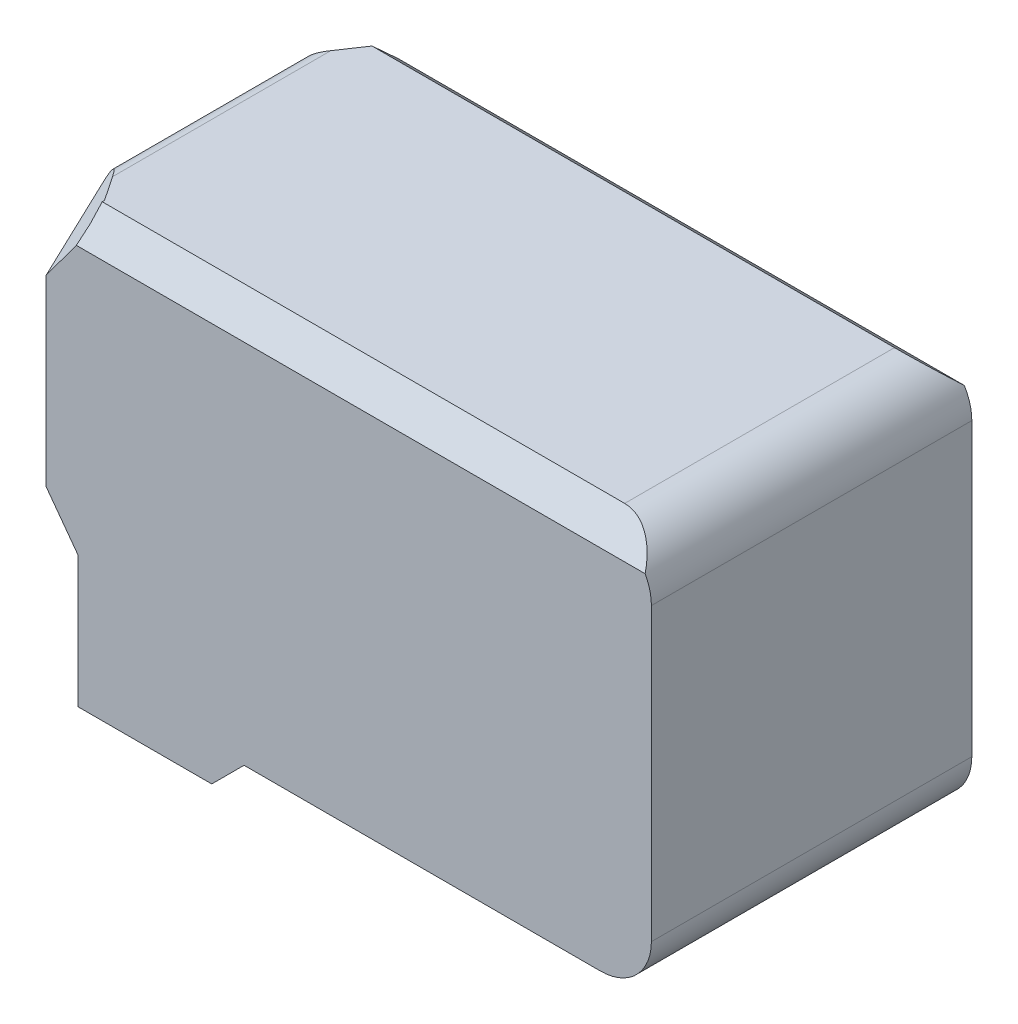
ISO-10303-21;
HEADER;
FILE_DESCRIPTION(('STEP AP214'),'2;1');
FILE_NAME('part.step','',(''),(''),'','','');
FILE_SCHEMA(('AUTOMOTIVE_DESIGN { 1 0 10303 214 1 1 1 1 }'));
ENDSEC;
DATA;
#1=APPLICATION_CONTEXT('core data for automotive mechanical design processes');
#2=APPLICATION_PROTOCOL_DEFINITION('international standard','automotive_design',2000,#1);
#3=PRODUCT_CONTEXT('',#1,'mechanical');
#4=PRODUCT('Part','Part','',(#3));
#5=PRODUCT_RELATED_PRODUCT_CATEGORY('part','',(#4));
#6=PRODUCT_DEFINITION_FORMATION('','',#4);
#7=PRODUCT_DEFINITION_CONTEXT('part definition',#1,'design');
#8=PRODUCT_DEFINITION('design','',#6,#7);
#9=PRODUCT_DEFINITION_SHAPE('','',#8);
#10=(LENGTH_UNIT() NAMED_UNIT(*) SI_UNIT(.MILLI.,.METRE.));
#11=(NAMED_UNIT(*) PLANE_ANGLE_UNIT() SI_UNIT($,.RADIAN.));
#12=(NAMED_UNIT(*) SI_UNIT($,.STERADIAN.) SOLID_ANGLE_UNIT());
#13=UNCERTAINTY_MEASURE_WITH_UNIT(LENGTH_MEASURE(1.E-05),#10,'distance_accuracy_value','');
#14=(GEOMETRIC_REPRESENTATION_CONTEXT(3) GLOBAL_UNCERTAINTY_ASSIGNED_CONTEXT((#13)) GLOBAL_UNIT_ASSIGNED_CONTEXT((#10,
#11,#12)) REPRESENTATION_CONTEXT('',''));
#15=CARTESIAN_POINT('',(0.,0.,0.));
#16=DIRECTION('',(0.,0.,1.));
#17=DIRECTION('',(1.,0.,0.));
#18=AXIS2_PLACEMENT_3D('',#15,#16,#17);
#19=CARTESIAN_POINT('',(0.,-22.97,0.));
#20=DIRECTION('',(0.,1.,0.));
#21=DIRECTION('',(0.,0.,1.));
#22=AXIS2_PLACEMENT_3D('',#19,#20,#21);
#23=PLANE('',#22);
#24=DIRECTION('',(1.,0.,0.));
#25=VECTOR('',#24,1.);
#26=CARTESIAN_POINT('',(59.435,-22.97,-15.735));
#27=LINE('',#26,#25);
#28=CARTESIAN_POINT('',(19.435,-22.97,-15.735));
#29=VERTEX_POINT('',#28);
#30=CARTESIAN_POINT('',(54.435,-22.97,-15.735));
#31=VERTEX_POINT('',#30);
#32=EDGE_CURVE('E262',#29,#31,#27,.T.);
#33=ORIENTED_EDGE('',*,*,#32,.T.);
#34=DIRECTION('',(0.,0.,1.));
#35=VECTOR('',#34,1.);
#36=CARTESIAN_POINT('',(54.435,-22.97,15.735));
#37=LINE('',#36,#35);
#38=CARTESIAN_POINT('',(54.435,-22.97,-12.56));
#39=VERTEX_POINT('',#38);
#40=EDGE_CURVE('E316',#31,#39,#37,.T.);
#41=ORIENTED_EDGE('',*,*,#40,.T.);
#42=DIRECTION('',(-1.,0.,0.));
#43=VECTOR('',#42,1.);
#44=CARTESIAN_POINT('',(56.26,-22.97,-12.56));
#45=LINE('',#44,#43);
#46=CARTESIAN_POINT('',(19.435,-22.97,-12.56));
#47=VERTEX_POINT('',#46);
#48=EDGE_CURVE('E275',#39,#47,#45,.T.);
#49=ORIENTED_EDGE('',*,*,#48,.T.);
#50=DIRECTION('',(0.,0.,-1.));
#51=VECTOR('',#50,1.);
#52=CARTESIAN_POINT('',(19.435,-22.97,15.735));
#53=LINE('',#52,#51);
#54=EDGE_CURVE('E242',#47,#29,#53,.T.);
#55=ORIENTED_EDGE('',*,*,#54,.T.);
#56=EDGE_LOOP('',(#33,#41,#49,#55));
#57=FACE_BOUND('',#56,.T.);
#58=ADVANCED_FACE('F63',(#57),#23,.F.);
#59=CARTESIAN_POINT('',(56.26,-22.97,12.56));
#60=DIRECTION('',(0.,1.,0.));
#61=DIRECTION('',(0.,0.,1.));
#62=AXIS2_PLACEMENT_3D('',#59,#60,#61);
#63=PLANE('',#62);
#64=DIRECTION('',(-1.,0.,0.));
#65=VECTOR('',#64,1.);
#66=CARTESIAN_POINT('',(56.26,-22.97,12.56));
#67=LINE('',#66,#65);
#68=CARTESIAN_POINT('',(19.435,-22.97,12.56));
#69=VERTEX_POINT('',#68);
#70=CARTESIAN_POINT('',(7.125,-22.97,12.56));
#71=VERTEX_POINT('',#70);
#72=EDGE_CURVE('E445',#69,#71,#67,.T.);
#73=ORIENTED_EDGE('',*,*,#72,.F.);
#74=EDGE_CURVE('E260',#69,#47,#53,.T.);
#75=ORIENTED_EDGE('',*,*,#74,.T.);
#76=CARTESIAN_POINT('',(7.125,-22.97,-12.56));
#77=VERTEX_POINT('',#76);
#78=EDGE_CURVE('E443',#47,#77,#45,.T.);
#79=ORIENTED_EDGE('',*,*,#78,.T.);
#80=DIRECTION('',(0.,0.,-1.));
#81=VECTOR('',#80,1.);
#82=CARTESIAN_POINT('',(7.125,-22.97,12.56));
#83=LINE('',#82,#81);
#84=EDGE_CURVE('E453',#71,#77,#83,.T.);
#85=ORIENTED_EDGE('',*,*,#84,.F.);
#86=EDGE_LOOP('',(#73,#75,#79,#85));
#87=FACE_BOUND('',#86,.T.);
#88=ADVANCED_FACE('F619',(#87),#63,.T.);
#89=CARTESIAN_POINT('',(3.125,0.,0.));
#90=DIRECTION('',(1.,0.,0.));
#91=DIRECTION('',(0.,0.,-1.));
#92=AXIS2_PLACEMENT_3D('',#89,#90,#91);
#93=PLANE('',#92);
#94=CARTESIAN_POINT('',(3.125,-7.,0.));
#95=DIRECTION('',(1.,0.,0.));
#96=DIRECTION('',(0.,0.,-1.));
#97=AXIS2_PLACEMENT_3D('',#94,#95,#96);
#98=CIRCLE('',#97,1.375);
#99=CARTESIAN_POINT('',(3.125,-7.,-1.375));
#100=VERTEX_POINT('',#99);
#101=EDGE_CURVE('E487',#100,#100,#98,.T.);
#102=ORIENTED_EDGE('',*,*,#101,.F.);
#103=EDGE_LOOP('',(#102));
#104=FACE_BOUND('',#103,.T.);
#105=CARTESIAN_POINT('',(3.125,0.,7.));
#106=DIRECTION('',(1.,0.,0.));
#107=DIRECTION('',(0.,0.,-1.));
#108=AXIS2_PLACEMENT_3D('',#105,#106,#107);
#109=CIRCLE('',#108,1.375);
#110=CARTESIAN_POINT('',(3.125,0.,5.625));
#111=VERTEX_POINT('',#110);
#112=EDGE_CURVE('E503',#111,#111,#109,.T.);
#113=ORIENTED_EDGE('',*,*,#112,.F.);
#114=EDGE_LOOP('',(#113));
#115=FACE_BOUND('',#114,.T.);
#116=CARTESIAN_POINT('',(3.125,7.,0.));
#117=DIRECTION('',(1.,0.,0.));
#118=DIRECTION('',(0.,0.,-1.));
#119=AXIS2_PLACEMENT_3D('',#116,#117,#118);
#120=CIRCLE('',#119,1.375);
#121=CARTESIAN_POINT('',(3.125,7.,-1.375));
#122=VERTEX_POINT('',#121);
#123=EDGE_CURVE('E511',#122,#122,#120,.T.);
#124=ORIENTED_EDGE('',*,*,#123,.F.);
#125=EDGE_LOOP('',(#124));
#126=FACE_BOUND('',#125,.T.);
#127=CARTESIAN_POINT('',(3.125,0.,-7.));
#128=DIRECTION('',(1.,0.,0.));
#129=DIRECTION('',(0.,0.,-1.));
#130=AXIS2_PLACEMENT_3D('',#127,#128,#129);
#131=CIRCLE('',#130,1.375);
#132=CARTESIAN_POINT('',(3.125,0.,-8.375));
#133=VERTEX_POINT('',#132);
#134=EDGE_CURVE('E495',#133,#133,#131,.T.);
#135=ORIENTED_EDGE('',*,*,#134,.F.);
#136=EDGE_LOOP('',(#135));
#137=FACE_BOUND('',#136,.T.);
#138=CARTESIAN_POINT('',(3.125,0.,0.));
#139=DIRECTION('',(-1.,0.,0.));
#140=DIRECTION('',(0.,0.,1.));
#141=AXIS2_PLACEMENT_3D('',#138,#139,#140);
#142=CIRCLE('',#141,11.);
#143=CARTESIAN_POINT('',(3.125,0.,11.));
#144=VERTEX_POINT('',#143);
#145=EDGE_CURVE('E466',#144,#144,#142,.T.);
#146=ORIENTED_EDGE('',*,*,#145,.F.);
#147=EDGE_LOOP('',(#146));
#148=FACE_BOUND('',#147,.T.);
#149=ADVANCED_FACE('F647',(#104,#115,#126,#137,#148),#93,.T.);
#150=CARTESIAN_POINT('',(0.,0.,0.));
#151=DIRECTION('',(1.,0.,0.));
#152=DIRECTION('',(0.,0.,-1.));
#153=AXIS2_PLACEMENT_3D('',#150,#151,#152);
#154=PLANE('',#153);
#155=DIRECTION('',(0.,-0.674777136921211,0.738021554894174));
#156=VECTOR('',#155,1.);
#157=CARTESIAN_POINT('',(0.,9.,15.735));
#158=LINE('',#157,#156);
#159=CARTESIAN_POINT('',(0.,14.115,10.140589569161));
#160=VERTEX_POINT('',#159);
#161=CARTESIAN_POINT('',(0.,9.,15.735));
#162=VERTEX_POINT('',#161);
#163=EDGE_CURVE('E515',#160,#162,#158,.T.);
#164=ORIENTED_EDGE('',*,*,#163,.F.);
#165=DIRECTION('',(0.,0.,1.));
#166=VECTOR('',#165,1.);
#167=CARTESIAN_POINT('',(0.,14.115,0.));
#168=LINE('',#167,#166);
#169=CARTESIAN_POINT('',(0.,14.115,-10.140589569161));
#170=VERTEX_POINT('',#169);
#171=EDGE_CURVE('E72',#160,#170,#168,.F.);
#172=ORIENTED_EDGE('',*,*,#171,.T.);
#173=DIRECTION('',(0.,0.674777136921211,0.738021554894174));
#174=VECTOR('',#173,1.);
#175=CARTESIAN_POINT('',(0.,9.,-15.735));
#176=LINE('',#175,#174);
#177=CARTESIAN_POINT('',(0.,9.,-15.735));
#178=VERTEX_POINT('',#177);
#179=EDGE_CURVE('E469',#178,#170,#176,.T.);
#180=ORIENTED_EDGE('',*,*,#179,.F.);
#181=DIRECTION('',(0.,1.,0.));
#182=VECTOR('',#181,1.);
#183=CARTESIAN_POINT('',(0.,0.,-15.735));
#184=LINE('',#183,#182);
#185=CARTESIAN_POINT('',(0.,-9.,-15.735));
#186=VERTEX_POINT('',#185);
#187=EDGE_CURVE('E536',#186,#178,#184,.T.);
#188=ORIENTED_EDGE('',*,*,#187,.F.);
#189=DIRECTION('',(0.,0.674777136921211,-0.738021554894174));
#190=VECTOR('',#189,1.);
#191=CARTESIAN_POINT('',(0.,-9.,-15.735));
#192=LINE('',#191,#190);
#193=CARTESIAN_POINT('',(0.,-15.615,-8.5));
#194=VERTEX_POINT('',#193);
#195=EDGE_CURVE('E532',#194,#186,#192,.T.);
#196=ORIENTED_EDGE('',*,*,#195,.F.);
#197=DIRECTION('',(0.,0.,-1.));
#198=VECTOR('',#197,1.);
#199=CARTESIAN_POINT('',(0.,-15.615,0.));
#200=LINE('',#199,#198);
#201=CARTESIAN_POINT('',(0.,-15.615,8.5));
#202=VERTEX_POINT('',#201);
#203=EDGE_CURVE('E528',#202,#194,#200,.T.);
#204=ORIENTED_EDGE('',*,*,#203,.F.);
#205=DIRECTION('',(0.,-0.674777136921211,-0.738021554894173));
#206=VECTOR('',#205,1.);
#207=CARTESIAN_POINT('',(0.,-9.,15.735));
#208=LINE('',#207,#206);
#209=CARTESIAN_POINT('',(0.,-9.,15.735));
#210=VERTEX_POINT('',#209);
#211=EDGE_CURVE('E524',#210,#202,#208,.T.);
#212=ORIENTED_EDGE('',*,*,#211,.F.);
#213=DIRECTION('',(0.,-1.,0.));
#214=VECTOR('',#213,1.);
#215=CARTESIAN_POINT('',(0.,0.,15.735));
#216=LINE('',#215,#214);
#217=EDGE_CURVE('E521',#162,#210,#216,.T.);
#218=ORIENTED_EDGE('',*,*,#217,.F.);
#219=EDGE_LOOP('',(#164,#172,#180,#188,#196,#204,#212,#218));
#220=FACE_BOUND('',#219,.T.);
#221=CARTESIAN_POINT('',(0.,7.,0.));
#222=DIRECTION('',(1.,0.,0.));
#223=DIRECTION('',(0.,0.,-1.));
#224=AXIS2_PLACEMENT_3D('',#221,#222,#223);
#225=CIRCLE('',#224,1.375);
#226=CARTESIAN_POINT('',(0.,7.,-1.375));
#227=VERTEX_POINT('',#226);
#228=EDGE_CURVE('E507',#227,#227,#225,.T.);
#229=ORIENTED_EDGE('',*,*,#228,.T.);
#230=EDGE_LOOP('',(#229));
#231=FACE_BOUND('',#230,.T.);
#232=CARTESIAN_POINT('',(0.,0.,7.));
#233=DIRECTION('',(1.,0.,0.));
#234=DIRECTION('',(0.,0.,-1.));
#235=AXIS2_PLACEMENT_3D('',#232,#233,#234);
#236=CIRCLE('',#235,1.375);
#237=CARTESIAN_POINT('',(0.,0.,5.625));
#238=VERTEX_POINT('',#237);
#239=EDGE_CURVE('E499',#238,#238,#236,.T.);
#240=ORIENTED_EDGE('',*,*,#239,.T.);
#241=EDGE_LOOP('',(#240));
#242=FACE_BOUND('',#241,.T.);
#243=CARTESIAN_POINT('',(0.,0.,-7.));
#244=DIRECTION('',(1.,0.,0.));
#245=DIRECTION('',(0.,0.,-1.));
#246=AXIS2_PLACEMENT_3D('',#243,#244,#245);
#247=CIRCLE('',#246,1.375);
#248=CARTESIAN_POINT('',(0.,0.,-8.375));
#249=VERTEX_POINT('',#248);
#250=EDGE_CURVE('E491',#249,#249,#247,.T.);
#251=ORIENTED_EDGE('',*,*,#250,.T.);
#252=EDGE_LOOP('',(#251));
#253=FACE_BOUND('',#252,.T.);
#254=CARTESIAN_POINT('',(0.,-7.,0.));
#255=DIRECTION('',(1.,0.,0.));
#256=DIRECTION('',(0.,0.,-1.));
#257=AXIS2_PLACEMENT_3D('',#254,#255,#256);
#258=CIRCLE('',#257,1.375);
#259=CARTESIAN_POINT('',(0.,-7.,-1.375));
#260=VERTEX_POINT('',#259);
#261=EDGE_CURVE('E484',#260,#260,#258,.T.);
#262=ORIENTED_EDGE('',*,*,#261,.T.);
#263=EDGE_LOOP('',(#262));
#264=FACE_BOUND('',#263,.T.);
#265=ADVANCED_FACE('F576',(#220,#231,#242,#253,#264),#154,.F.);
#266=CARTESIAN_POINT('',(3.125,0.,15.735));
#267=DIRECTION('',(0.,0.,-1.));
#268=DIRECTION('',(-1.,0.,0.));
#269=AXIS2_PLACEMENT_3D('',#266,#267,#268);
#270=PLANE('',#269);
#271=DIRECTION('',(-1.,0.,0.));
#272=VECTOR('',#271,1.);
#273=CARTESIAN_POINT('',(59.435,-22.97,15.735));
#274=LINE('',#273,#272);
#275=CARTESIAN_POINT('',(54.435,-22.97,15.735));
#276=VERTEX_POINT('',#275);
#277=CARTESIAN_POINT('',(19.435,-22.97,15.735));
#278=VERTEX_POINT('',#277);
#279=EDGE_CURVE('E230',#276,#278,#274,.T.);
#280=ORIENTED_EDGE('',*,*,#279,.F.);
#281=CARTESIAN_POINT('',(54.435,-17.97,15.735));
#282=DIRECTION('',(0.,0.,-1.));
#283=DIRECTION('',(-1.,0.,0.));
#284=AXIS2_PLACEMENT_3D('',#281,#282,#283);
#285=CIRCLE('',#284,5.);
#286=CARTESIAN_POINT('',(59.435,-17.97,15.735));
#287=VERTEX_POINT('',#286);
#288=EDGE_CURVE('E328',#276,#287,#285,.F.);
#289=ORIENTED_EDGE('',*,*,#288,.T.);
#290=DIRECTION('',(0.,-1.,0.));
#291=VECTOR('',#290,1.);
#292=CARTESIAN_POINT('',(59.435,13.0176857674551,15.735));
#293=LINE('',#292,#291);
#294=CARTESIAN_POINT('',(59.435,10.615,15.735));
#295=VERTEX_POINT('',#294);
#296=EDGE_CURVE('E267',#295,#287,#293,.T.);
#297=ORIENTED_EDGE('',*,*,#296,.F.);
#298=CARTESIAN_POINT('',(54.435,10.615,15.735));
#299=DIRECTION('',(0.,0.,-1.));
#300=DIRECTION('',(-1.,0.,0.));
#301=AXIS2_PLACEMENT_3D('',#298,#299,#300);
#302=CIRCLE('',#301,5.);
#303=CARTESIAN_POINT('',(58.8198718456608,13.0176857674551,15.735));
#304=VERTEX_POINT('',#303);
#305=EDGE_CURVE('E298',#295,#304,#302,.F.);
#306=ORIENTED_EDGE('',*,*,#305,.T.);
#307=DIRECTION('',(-1.,0.,0.));
#308=VECTOR('',#307,1.);
#309=CARTESIAN_POINT('',(3.125,13.0176857674551,15.735));
#310=LINE('',#309,#308);
#311=CARTESIAN_POINT('',(2.96513869717342,13.0176857674551,15.735));
#312=VERTEX_POINT('',#311);
#313=EDGE_CURVE('E378',#304,#312,#310,.T.);
#314=ORIENTED_EDGE('',*,*,#313,.T.);
#315=DIRECTION('',(-0.593813918201551,-0.804602405259966,0.));
#316=VECTOR('',#315,1.);
#317=CARTESIAN_POINT('',(-3.19813518222544,4.66661005899207,15.735));
#318=LINE('',#317,#316);
#319=EDGE_CURVE('E358',#312,#162,#318,.T.);
#320=ORIENTED_EDGE('',*,*,#319,.T.);
#321=ORIENTED_EDGE('',*,*,#217,.T.);
#322=DIRECTION('',(0.593813918201551,-0.804602405259965,0.));
#323=VECTOR('',#322,1.);
#324=CARTESIAN_POINT('',(-3.19813518222544,-4.66661005899207,15.735));
#325=LINE('',#324,#323);
#326=CARTESIAN_POINT('',(3.125,-13.2342936724227,15.735));
#327=VERTEX_POINT('',#326);
#328=EDGE_CURVE('E375',#210,#327,#325,.T.);
#329=ORIENTED_EDGE('',*,*,#328,.T.);
#330=DIRECTION('',(0.,1.,0.));
#331=VECTOR('',#330,1.);
#332=CARTESIAN_POINT('',(3.125,15.615,15.735));
#333=LINE('',#332,#331);
#334=CARTESIAN_POINT('',(3.125,-26.145,15.735));
#335=VERTEX_POINT('',#334);
#336=EDGE_CURVE('E474',#335,#327,#333,.T.);
#337=ORIENTED_EDGE('',*,*,#336,.F.);
#338=DIRECTION('',(-1.,0.,0.));
#339=VECTOR('',#338,1.);
#340=CARTESIAN_POINT('',(7.125,-26.145,15.735));
#341=LINE('',#340,#339);
#342=CARTESIAN_POINT('',(16.26,-26.145,15.735));
#343=VERTEX_POINT('',#342);
#344=EDGE_CURVE('E249',#343,#335,#341,.T.);
#345=ORIENTED_EDGE('',*,*,#344,.F.);
#346=DIRECTION('',(0.707106781186549,0.707106781186546,0.));
#347=VECTOR('',#346,1.);
#348=CARTESIAN_POINT('',(19.435,-22.97,15.735));
#349=LINE('',#348,#347);
#350=EDGE_CURVE('E246',#343,#278,#349,.T.);
#351=ORIENTED_EDGE('',*,*,#350,.T.);
#352=EDGE_LOOP('',(#280,#289,#297,#306,#314,#320,#321,#329,#337,#345,#351));
#353=FACE_BOUND('',#352,.T.);
#354=ADVANCED_FACE('F247',(#353),#270,.F.);
#355=CARTESIAN_POINT('',(3.125,0.,-15.735));
#356=DIRECTION('',(0.,0.,1.));
#357=DIRECTION('',(1.,0.,0.));
#358=AXIS2_PLACEMENT_3D('',#355,#356,#357);
#359=PLANE('',#358);
#360=DIRECTION('',(0.,1.,0.));
#361=VECTOR('',#360,1.);
#362=CARTESIAN_POINT('',(59.435,-26.145,-15.735));
#363=LINE('',#362,#361);
#364=CARTESIAN_POINT('',(59.435,-17.97,-15.735));
#365=VERTEX_POINT('',#364);
#366=CARTESIAN_POINT('',(59.435,10.615,-15.735));
#367=VERTEX_POINT('',#366);
#368=EDGE_CURVE('E429',#365,#367,#363,.T.);
#369=ORIENTED_EDGE('',*,*,#368,.F.);
#370=CARTESIAN_POINT('',(54.435,-17.97,-15.735));
#371=DIRECTION('',(0.,0.,1.));
#372=DIRECTION('',(1.,0.,0.));
#373=AXIS2_PLACEMENT_3D('',#370,#371,#372);
#374=CIRCLE('',#373,5.);
#375=EDGE_CURVE('E283',#365,#31,#374,.F.);
#376=ORIENTED_EDGE('',*,*,#375,.T.);
#377=ORIENTED_EDGE('',*,*,#32,.F.);
#378=DIRECTION('',(-0.707106781186549,-0.707106781186546,0.));
#379=VECTOR('',#378,1.);
#380=CARTESIAN_POINT('',(19.435,-22.97,-15.735));
#381=LINE('',#380,#379);
#382=CARTESIAN_POINT('',(16.26,-26.145,-15.735));
#383=VERTEX_POINT('',#382);
#384=EDGE_CURVE('E280',#29,#383,#381,.T.);
#385=ORIENTED_EDGE('',*,*,#384,.T.);
#386=DIRECTION('',(-1.,0.,0.));
#387=VECTOR('',#386,1.);
#388=CARTESIAN_POINT('',(7.125,-26.145,-15.735));
#389=LINE('',#388,#387);
#390=CARTESIAN_POINT('',(3.125,-26.145,-15.735));
#391=VERTEX_POINT('',#390);
#392=EDGE_CURVE('E481',#383,#391,#389,.T.);
#393=ORIENTED_EDGE('',*,*,#392,.T.);
#394=DIRECTION('',(0.,-1.,0.));
#395=VECTOR('',#394,1.);
#396=CARTESIAN_POINT('',(3.125,-9.,-15.735));
#397=LINE('',#396,#395);
#398=CARTESIAN_POINT('',(3.125,-13.2342936724228,-15.735));
#399=VERTEX_POINT('',#398);
#400=EDGE_CURVE('E420',#399,#391,#397,.T.);
#401=ORIENTED_EDGE('',*,*,#400,.F.);
#402=DIRECTION('',(-0.593813918201551,0.804602405259965,0.));
#403=VECTOR('',#402,1.);
#404=CARTESIAN_POINT('',(-3.19813518222544,-4.66661005899207,-15.735));
#405=LINE('',#404,#403);
#406=EDGE_CURVE('E372',#399,#186,#405,.T.);
#407=ORIENTED_EDGE('',*,*,#406,.T.);
#408=ORIENTED_EDGE('',*,*,#187,.T.);
#409=DIRECTION('',(0.593813918201551,0.804602405259966,0.));
#410=VECTOR('',#409,1.);
#411=CARTESIAN_POINT('',(-3.19813518222544,4.66661005899207,-15.735));
#412=LINE('',#411,#410);
#413=CARTESIAN_POINT('',(3.125,13.2342936724228,-15.735));
#414=VERTEX_POINT('',#413);
#415=EDGE_CURVE('E362',#178,#414,#412,.T.);
#416=ORIENTED_EDGE('',*,*,#415,.T.);
#417=CARTESIAN_POINT('',(3.125,13.235,-15.735));
#418=VERTEX_POINT('',#417);
#419=EDGE_CURVE('E410',#418,#414,#397,.T.);
#420=ORIENTED_EDGE('',*,*,#419,.F.);
#421=DIRECTION('',(1.,0.,0.));
#422=VECTOR('',#421,1.);
#423=CARTESIAN_POINT('',(3.125,13.235,-15.735));
#424=LINE('',#423,#422);
#425=CARTESIAN_POINT('',(58.6935913163862,13.235,-15.735));
#426=VERTEX_POINT('',#425);
#427=EDGE_CURVE('E285',#418,#426,#424,.T.);
#428=ORIENTED_EDGE('',*,*,#427,.T.);
#429=CARTESIAN_POINT('',(54.435,10.615,-15.735));
#430=DIRECTION('',(0.,0.,1.));
#431=DIRECTION('',(1.,0.,0.));
#432=AXIS2_PLACEMENT_3D('',#429,#430,#431);
#433=CIRCLE('',#432,5.);
#434=EDGE_CURVE('E310',#426,#367,#433,.F.);
#435=ORIENTED_EDGE('',*,*,#434,.T.);
#436=EDGE_LOOP('',(#369,#376,#377,#385,#393,#401,#407,#408,#416,#420,#428,#435));
#437=FACE_BOUND('',#436,.T.);
#438=ADVANCED_FACE('F279',(#437),#359,.F.);
#439=CARTESIAN_POINT('',(3.125,15.615,0.));
#440=DIRECTION('',(0.,-1.,0.));
#441=DIRECTION('',(0.,0.,-1.));
#442=AXIS2_PLACEMENT_3D('',#439,#440,#441);
#443=PLANE('',#442);
#444=DIRECTION('',(-0.559345934671908,0.,0.828934331154169));
#445=VECTOR('',#444,1.);
#446=CARTESIAN_POINT('',(-2.9634068018178,15.615,-4.10831771014224));
#447=LINE('',#446,#445);
#448=CARTESIAN_POINT('',(3.125,15.615,-13.1311586878275));
#449=VERTEX_POINT('',#448);
#450=CARTESIAN_POINT('',(1.5,15.615,-10.7229561701572));
#451=VERTEX_POINT('',#450);
#452=EDGE_CURVE('E350',#449,#451,#447,.T.);
#453=ORIENTED_EDGE('',*,*,#452,.T.);
#454=DIRECTION('',(0.,0.,1.));
#455=VECTOR('',#454,1.);
#456=CARTESIAN_POINT('',(1.5,15.615,0.));
#457=LINE('',#456,#455);
#458=CARTESIAN_POINT('',(1.5,15.615,10.7229561701572));
#459=VERTEX_POINT('',#458);
#460=EDGE_CURVE('E336',#451,#459,#457,.T.);
#461=ORIENTED_EDGE('',*,*,#460,.T.);
#462=DIRECTION('',(0.559345934671908,0.,0.828934331154169));
#463=VECTOR('',#462,1.);
#464=CARTESIAN_POINT('',(-2.96340680181781,15.615,4.10831771014224));
#465=LINE('',#464,#463);
#466=CARTESIAN_POINT('',(3.125,15.615,13.1311586878275));
#467=VERTEX_POINT('',#466);
#468=EDGE_CURVE('E347',#459,#467,#465,.T.);
#469=ORIENTED_EDGE('',*,*,#468,.T.);
#470=DIRECTION('',(0.,0.,-1.));
#471=VECTOR('',#470,1.);
#472=CARTESIAN_POINT('',(3.125,15.615,8.5));
#473=LINE('',#472,#471);
#474=CARTESIAN_POINT('',(3.125,15.615,13.355));
#475=VERTEX_POINT('',#474);
#476=EDGE_CURVE('E478',#475,#467,#473,.T.);
#477=ORIENTED_EDGE('',*,*,#476,.F.);
#478=DIRECTION('',(1.,0.,0.));
#479=VECTOR('',#478,1.);
#480=CARTESIAN_POINT('',(3.125,15.615,13.355));
#481=LINE('',#480,#479);
#482=CARTESIAN_POINT('',(54.435,15.615,13.355));
#483=VERTEX_POINT('',#482);
#484=EDGE_CURVE('E400',#475,#483,#481,.T.);
#485=ORIENTED_EDGE('',*,*,#484,.T.);
#486=DIRECTION('',(0.,0.,1.));
#487=VECTOR('',#486,1.);
#488=CARTESIAN_POINT('',(54.435,15.615,-13.1376857674551));
#489=LINE('',#488,#487);
#490=CARTESIAN_POINT('',(54.435,15.615,-13.1376857674551));
#491=VERTEX_POINT('',#490);
#492=EDGE_CURVE('E304',#483,#491,#489,.F.);
#493=ORIENTED_EDGE('',*,*,#492,.T.);
#494=DIRECTION('',(-1.,0.,0.));
#495=VECTOR('',#494,1.);
#496=CARTESIAN_POINT('',(3.125,15.615,-13.1376857674551));
#497=LINE('',#496,#495);
#498=CARTESIAN_POINT('',(3.125,15.615,-13.1376857674551));
#499=VERTEX_POINT('',#498);
#500=EDGE_CURVE('E397',#491,#499,#497,.T.);
#501=ORIENTED_EDGE('',*,*,#500,.T.);
#502=EDGE_CURVE('E411',#449,#499,#473,.T.);
#503=ORIENTED_EDGE('',*,*,#502,.F.);
#504=EDGE_LOOP('',(#453,#461,#469,#477,#485,#493,#501,#503));
#505=FACE_BOUND('',#504,.T.);
#506=ADVANCED_FACE('F345',(#505),#443,.F.);
#507=CARTESIAN_POINT('',(3.125,7.,0.));
#508=DIRECTION('',(-1.,0.,0.));
#509=DIRECTION('',(0.,0.,1.));
#510=AXIS2_PLACEMENT_3D('',#507,#508,#509);
#511=CYLINDRICAL_SURFACE('',#510,1.375);
#512=ORIENTED_EDGE('',*,*,#123,.T.);
#513=EDGE_LOOP('',(#512));
#514=FACE_BOUND('',#513,.T.);
#515=ORIENTED_EDGE('',*,*,#228,.F.);
#516=EDGE_LOOP('',(#515));
#517=FACE_BOUND('',#516,.T.);
#518=ADVANCED_FACE('F693',(#514,#517),#511,.F.);
#519=CARTESIAN_POINT('',(3.125,0.,7.));
#520=DIRECTION('',(-1.,0.,0.));
#521=DIRECTION('',(0.,0.,1.));
#522=AXIS2_PLACEMENT_3D('',#519,#520,#521);
#523=CYLINDRICAL_SURFACE('',#522,1.375);
#524=ORIENTED_EDGE('',*,*,#112,.T.);
#525=EDGE_LOOP('',(#524));
#526=FACE_BOUND('',#525,.T.);
#527=ORIENTED_EDGE('',*,*,#239,.F.);
#528=EDGE_LOOP('',(#527));
#529=FACE_BOUND('',#528,.T.);
#530=ADVANCED_FACE('F755',(#526,#529),#523,.F.);
#531=CARTESIAN_POINT('',(3.125,0.,-7.));
#532=DIRECTION('',(-1.,0.,0.));
#533=DIRECTION('',(0.,0.,1.));
#534=AXIS2_PLACEMENT_3D('',#531,#532,#533);
#535=CYLINDRICAL_SURFACE('',#534,1.375);
#536=ORIENTED_EDGE('',*,*,#134,.T.);
#537=EDGE_LOOP('',(#536));
#538=FACE_BOUND('',#537,.T.);
#539=ORIENTED_EDGE('',*,*,#250,.F.);
#540=EDGE_LOOP('',(#539));
#541=FACE_BOUND('',#540,.T.);
#542=ADVANCED_FACE('F765',(#538,#541),#535,.F.);
#543=CARTESIAN_POINT('',(3.125,-7.,0.));
#544=DIRECTION('',(-1.,0.,0.));
#545=DIRECTION('',(0.,0.,1.));
#546=AXIS2_PLACEMENT_3D('',#543,#544,#545);
#547=CYLINDRICAL_SURFACE('',#546,1.375);
#548=ORIENTED_EDGE('',*,*,#101,.T.);
#549=EDGE_LOOP('',(#548));
#550=FACE_BOUND('',#549,.T.);
#551=ORIENTED_EDGE('',*,*,#261,.F.);
#552=EDGE_LOOP('',(#551));
#553=FACE_BOUND('',#552,.T.);
#554=ADVANCED_FACE('F775',(#550,#553),#547,.F.);
#555=CARTESIAN_POINT('',(3.125,0.,0.));
#556=DIRECTION('',(-1.,0.,0.));
#557=DIRECTION('',(0.,0.,1.));
#558=AXIS2_PLACEMENT_3D('',#555,#556,#557);
#559=PLANE('',#558);
#560=DIRECTION('',(0.,-0.674777136921211,0.738021554894174));
#561=VECTOR('',#560,1.);
#562=CARTESIAN_POINT('',(3.125,15.0444308281757,13.7552052423473));
#563=LINE('',#562,#561);
#564=CARTESIAN_POINT('',(3.125,14.3531772148888,14.5112475540828));
#565=VERTEX_POINT('',#564);
#566=EDGE_CURVE('E356',#467,#565,#563,.T.);
#567=ORIENTED_EDGE('',*,*,#566,.T.);
#568=DIRECTION('',(0.,-0.737277336810122,0.675590207615662));
#569=VECTOR('',#568,1.);
#570=CARTESIAN_POINT('',(3.125,13.7791216350053,15.0372725775488));
#571=LINE('',#570,#569);
#572=EDGE_CURVE('E394',#565,#475,#571,.F.);
#573=ORIENTED_EDGE('',*,*,#572,.T.);
#574=ORIENTED_EDGE('',*,*,#476,.T.);
#575=EDGE_LOOP('',(#567,#573,#574));
#576=FACE_BOUND('',#575,.T.);
#577=ADVANCED_FACE('F784',(#576),#559,.T.);
#578=DIRECTION('',(0.,0.,-1.));
#579=VECTOR('',#578,1.);
#580=CARTESIAN_POINT('',(3.125,-18.74,0.));
#581=LINE('',#580,#579);
#582=CARTESIAN_POINT('',(3.125,-18.74,9.71326375207538));
#583=VERTEX_POINT('',#582);
#584=CARTESIAN_POINT('',(3.125,-18.74,-9.71326375207538));
#585=VERTEX_POINT('',#584);
#586=EDGE_CURVE('E549',#583,#585,#581,.T.);
#587=ORIENTED_EDGE('',*,*,#586,.T.);
#588=DIRECTION('',(0.,0.674777136921211,-0.738021554894174));
#589=VECTOR('',#588,1.);
#590=CARTESIAN_POINT('',(3.125,-15.0444308281757,-13.7552052423473));
#591=LINE('',#590,#589);
#592=EDGE_CURVE('E365',#585,#399,#591,.T.);
#593=ORIENTED_EDGE('',*,*,#592,.T.);
#594=ORIENTED_EDGE('',*,*,#400,.T.);
#595=DIRECTION('',(0.,0.,1.));
#596=VECTOR('',#595,1.);
#597=CARTESIAN_POINT('',(3.125,-26.145,-15.735));
#598=LINE('',#597,#596);
#599=EDGE_CURVE('E419',#391,#335,#598,.T.);
#600=ORIENTED_EDGE('',*,*,#599,.T.);
#601=ORIENTED_EDGE('',*,*,#336,.T.);
#602=DIRECTION('',(0.,-0.674777136921211,-0.738021554894174));
#603=VECTOR('',#602,1.);
#604=CARTESIAN_POINT('',(3.125,-15.0444308281757,13.7552052423473));
#605=LINE('',#604,#603);
#606=EDGE_CURVE('E546',#327,#583,#605,.T.);
#607=ORIENTED_EDGE('',*,*,#606,.T.);
#608=EDGE_LOOP('',(#587,#593,#594,#600,#601,#607));
#609=FACE_BOUND('',#608,.T.);
#610=ADVANCED_FACE('F557',(#609),#559,.T.);
#611=CARTESIAN_POINT('',(7.125,-26.145,-15.735));
#612=DIRECTION('',(0.,-1.,0.));
#613=DIRECTION('',(0.,0.,-1.));
#614=AXIS2_PLACEMENT_3D('',#611,#612,#613);
#615=PLANE('',#614);
#616=ORIENTED_EDGE('',*,*,#392,.F.);
#617=DIRECTION('',(0.,0.,1.));
#618=VECTOR('',#617,1.);
#619=CARTESIAN_POINT('',(16.26,-26.145,15.735));
#620=LINE('',#619,#618);
#621=EDGE_CURVE('E254',#383,#343,#620,.T.);
#622=ORIENTED_EDGE('',*,*,#621,.T.);
#623=ORIENTED_EDGE('',*,*,#344,.T.);
#624=ORIENTED_EDGE('',*,*,#599,.F.);
#625=EDGE_LOOP('',(#616,#622,#623,#624));
#626=FACE_BOUND('',#625,.T.);
#627=ADVANCED_FACE('F566',(#626),#615,.T.);
#628=CARTESIAN_POINT('',(7.125,0.,0.));
#629=DIRECTION('',(-1.,0.,0.));
#630=DIRECTION('',(0.,0.,1.));
#631=AXIS2_PLACEMENT_3D('',#628,#629,#630);
#632=PLANE('',#631);
#633=ORIENTED_EDGE('',*,*,#84,.T.);
#634=DIRECTION('',(0.,1.,0.));
#635=VECTOR('',#634,1.);
#636=CARTESIAN_POINT('',(7.125,-22.97,-12.56));
#637=LINE('',#636,#635);
#638=CARTESIAN_POINT('',(7.125,12.44,-12.56));
#639=VERTEX_POINT('',#638);
#640=EDGE_CURVE('E432',#77,#639,#637,.T.);
#641=ORIENTED_EDGE('',*,*,#640,.T.);
#642=DIRECTION('',(0.,0.,1.));
#643=VECTOR('',#642,1.);
#644=CARTESIAN_POINT('',(7.125,12.44,-12.56));
#645=LINE('',#644,#643);
#646=CARTESIAN_POINT('',(7.125,12.44,12.56));
#647=VERTEX_POINT('',#646);
#648=EDGE_CURVE('E605',#639,#647,#645,.T.);
#649=ORIENTED_EDGE('',*,*,#648,.T.);
#650=DIRECTION('',(0.,-1.,0.));
#651=VECTOR('',#650,1.);
#652=CARTESIAN_POINT('',(7.125,12.44,12.56));
#653=LINE('',#652,#651);
#654=EDGE_CURVE('E608',#647,#71,#653,.T.);
#655=ORIENTED_EDGE('',*,*,#654,.T.);
#656=EDGE_LOOP('',(#633,#641,#649,#655));
#657=FACE_BOUND('',#656,.T.);
#658=CARTESIAN_POINT('',(7.125,0.,0.));
#659=DIRECTION('',(-1.,0.,0.));
#660=DIRECTION('',(0.,0.,1.));
#661=AXIS2_PLACEMENT_3D('',#658,#659,#660);
#662=CIRCLE('',#661,11.);
#663=CARTESIAN_POINT('',(7.125,0.,11.));
#664=VERTEX_POINT('',#663);
#665=EDGE_CURVE('E388',#664,#664,#662,.T.);
#666=ORIENTED_EDGE('',*,*,#665,.T.);
#667=EDGE_LOOP('',(#666));
#668=FACE_BOUND('',#667,.T.);
#669=ADVANCED_FACE('F616',(#657,#668),#632,.F.);
#670=ORIENTED_EDGE('',*,*,#502,.T.);
#671=DIRECTION('',(0.,0.67559020761566,0.737277336810124));
#672=VECTOR('',#671,1.);
#673=CARTESIAN_POINT('',(3.125,15.0318149148694,-13.7741206085549));
#674=LINE('',#673,#672);
#675=EDGE_CURVE('E291',#499,#418,#674,.F.);
#676=ORIENTED_EDGE('',*,*,#675,.T.);
#677=ORIENTED_EDGE('',*,*,#419,.T.);
#678=DIRECTION('',(0.,0.674777136921211,0.738021554894174));
#679=VECTOR('',#678,1.);
#680=CARTESIAN_POINT('',(3.125,15.0444308281757,-13.7552052423473));
#681=LINE('',#680,#679);
#682=EDGE_CURVE('E543',#414,#449,#681,.T.);
#683=ORIENTED_EDGE('',*,*,#682,.T.);
#684=EDGE_LOOP('',(#670,#676,#677,#683));
#685=FACE_BOUND('',#684,.T.);
#686=ADVANCED_FACE('F408',(#685),#559,.T.);
#687=CARTESIAN_POINT('',(7.125,0.,0.));
#688=DIRECTION('',(-1.,0.,0.));
#689=DIRECTION('',(0.,0.,1.));
#690=AXIS2_PLACEMENT_3D('',#687,#688,#689);
#691=CYLINDRICAL_SURFACE('',#690,11.);
#692=ORIENTED_EDGE('',*,*,#665,.F.);
#693=EDGE_LOOP('',(#692));
#694=FACE_BOUND('',#693,.T.);
#695=ORIENTED_EDGE('',*,*,#145,.T.);
#696=EDGE_LOOP('',(#695));
#697=FACE_BOUND('',#696,.T.);
#698=ADVANCED_FACE('F685',(#694,#697),#691,.F.);
#699=CARTESIAN_POINT('',(3.125,15.0444308281757,13.7552052423473));
#700=DIRECTION('',(0.707106781186548,-0.521860046127509,-0.477139489306631));
#701=DIRECTION('',(0.,-0.674777136921211,0.738021554894174));
#702=AXIS2_PLACEMENT_3D('',#699,#700,#701);
#703=PLANE('',#702);
#704=ORIENTED_EDGE('',*,*,#468,.F.);
#705=CARTESIAN_POINT('',(1.5,14.115,12.3635457393182));
#706=DIRECTION('',(0.707106781186548,-0.521860046127509,-0.477139489306631));
#707=DIRECTION('',(0.383907580740627,-0.283332069673858,0.878827575662147));
#708=AXIS2_PLACEMENT_3D('',#705,#706,#707);
#709=ELLIPSE('',#708,3.14373476439724,1.5);
#710=EDGE_CURVE('E86',#459,#160,#709,.F.);
#711=ORIENTED_EDGE('',*,*,#710,.T.);
#712=ORIENTED_EDGE('',*,*,#163,.T.);
#713=ORIENTED_EDGE('',*,*,#319,.F.);
#714=DIRECTION('',(-0.0879120432657819,-0.734422776694341,0.672974485193465));
#715=VECTOR('',#714,1.);
#716=CARTESIAN_POINT('',(2.96637418962471,13.0280071496339,15.7255421957507));
#717=LINE('',#716,#715);
#718=EDGE_CURVE('E391',#312,#565,#717,.F.);
#719=ORIENTED_EDGE('',*,*,#718,.T.);
#720=ORIENTED_EDGE('',*,*,#566,.F.);
#721=EDGE_LOOP('',(#704,#711,#712,#713,#719,#720));
#722=FACE_BOUND('',#721,.T.);
#723=ADVANCED_FACE('F354',(#722),#703,.F.);
#724=CARTESIAN_POINT('',(3.125,15.0444308281757,-13.7552052423473));
#725=DIRECTION('',(0.707106781186548,-0.521860046127509,0.477139489306631));
#726=DIRECTION('',(0.,0.674777136921211,0.738021554894174));
#727=AXIS2_PLACEMENT_3D('',#724,#725,#726);
#728=PLANE('',#727);
#729=ORIENTED_EDGE('',*,*,#179,.T.);
#730=CARTESIAN_POINT('',(1.5,14.115,-12.3635457393182));
#731=DIRECTION('',(0.707106781186548,-0.521860046127509,0.477139489306631));
#732=DIRECTION('',(-0.383907580740627,0.283332069673857,0.878827575662147));
#733=AXIS2_PLACEMENT_3D('',#730,#731,#732);
#734=ELLIPSE('',#733,3.14373476439724,1.5);
#735=EDGE_CURVE('E13',#170,#451,#734,.F.);
#736=ORIENTED_EDGE('',*,*,#735,.T.);
#737=ORIENTED_EDGE('',*,*,#452,.F.);
#738=ORIENTED_EDGE('',*,*,#682,.F.);
#739=ORIENTED_EDGE('',*,*,#415,.F.);
#740=EDGE_LOOP('',(#729,#736,#737,#738,#739));
#741=FACE_BOUND('',#740,.T.);
#742=ADVANCED_FACE('F579',(#741),#728,.F.);
#743=CARTESIAN_POINT('',(3.125,-15.0444308281757,13.7552052423473));
#744=DIRECTION('',(0.707106781186548,0.52186004612751,-0.477139489306631));
#745=DIRECTION('',(0.,-0.674777136921211,-0.738021554894174));
#746=AXIS2_PLACEMENT_3D('',#743,#744,#745);
#747=PLANE('',#746);
#748=ORIENTED_EDGE('',*,*,#328,.F.);
#749=ORIENTED_EDGE('',*,*,#211,.T.);
#750=DIRECTION('',(0.681877999656666,-0.681877999656666,0.264735315302752));
#751=VECTOR('',#750,1.);
#752=CARTESIAN_POINT('',(2.13635691232554,-17.7513569123255,9.32942860903048));
#753=LINE('',#752,#751);
#754=EDGE_CURVE('E383',#583,#202,#753,.F.);
#755=ORIENTED_EDGE('',*,*,#754,.F.);
#756=ORIENTED_EDGE('',*,*,#606,.F.);
#757=EDGE_LOOP('',(#748,#749,#755,#756));
#758=FACE_BOUND('',#757,.T.);
#759=ADVANCED_FACE('F571',(#758),#747,.F.);
#760=CARTESIAN_POINT('',(3.125,-18.74,0.));
#761=DIRECTION('',(0.707106781186547,0.707106781186548,0.));
#762=DIRECTION('',(0.,0.,-1.));
#763=AXIS2_PLACEMENT_3D('',#760,#761,#762);
#764=PLANE('',#763);
#765=ORIENTED_EDGE('',*,*,#754,.T.);
#766=ORIENTED_EDGE('',*,*,#203,.T.);
#767=DIRECTION('',(0.681877999656666,-0.681877999656666,-0.264735315302752));
#768=VECTOR('',#767,1.);
#769=CARTESIAN_POINT('',(1.3715889485831,-16.9865889485831,-9.03251172930018));
#770=LINE('',#769,#768);
#771=EDGE_CURVE('E379',#585,#194,#770,.F.);
#772=ORIENTED_EDGE('',*,*,#771,.F.);
#773=ORIENTED_EDGE('',*,*,#586,.F.);
#774=EDGE_LOOP('',(#765,#766,#772,#773));
#775=FACE_BOUND('',#774,.T.);
#776=ADVANCED_FACE('F574',(#775),#764,.F.);
#777=CARTESIAN_POINT('',(3.125,-15.0444308281757,-13.7552052423473));
#778=DIRECTION('',(0.707106781186548,0.52186004612751,0.477139489306632));
#779=DIRECTION('',(0.,0.674777136921211,-0.738021554894174));
#780=AXIS2_PLACEMENT_3D('',#777,#778,#779);
#781=PLANE('',#780);
#782=ORIENTED_EDGE('',*,*,#771,.T.);
#783=ORIENTED_EDGE('',*,*,#195,.T.);
#784=ORIENTED_EDGE('',*,*,#406,.F.);
#785=ORIENTED_EDGE('',*,*,#592,.F.);
#786=EDGE_LOOP('',(#782,#783,#784,#785));
#787=FACE_BOUND('',#786,.T.);
#788=ADVANCED_FACE('F575',(#787),#781,.F.);
#789=CARTESIAN_POINT('',(56.26,-22.97,-12.56));
#790=DIRECTION('',(0.,0.,1.));
#791=DIRECTION('',(0.,-1.,0.));
#792=AXIS2_PLACEMENT_3D('',#789,#790,#791);
#793=PLANE('',#792);
#794=ORIENTED_EDGE('',*,*,#48,.F.);
#795=CARTESIAN_POINT('',(54.435,-17.97,-12.56));
#796=DIRECTION('',(0.,0.,1.));
#797=DIRECTION('',(0.,-1.,0.));
#798=AXIS2_PLACEMENT_3D('',#795,#796,#797);
#799=CIRCLE('',#798,5.);
#800=CARTESIAN_POINT('',(56.26,-22.6250375938332,-12.56));
#801=VERTEX_POINT('',#800);
#802=EDGE_CURVE('E319',#39,#801,#799,.T.);
#803=ORIENTED_EDGE('',*,*,#802,.T.);
#804=DIRECTION('',(0.,1.,0.));
#805=VECTOR('',#804,1.);
#806=CARTESIAN_POINT('',(56.26,-22.97,-12.56));
#807=LINE('',#806,#805);
#808=CARTESIAN_POINT('',(56.26,12.44,-12.56));
#809=VERTEX_POINT('',#808);
#810=EDGE_CURVE('E592',#801,#809,#807,.T.);
#811=ORIENTED_EDGE('',*,*,#810,.T.);
#812=DIRECTION('',(-1.,0.,0.));
#813=VECTOR('',#812,1.);
#814=CARTESIAN_POINT('',(56.26,12.44,-12.56));
#815=LINE('',#814,#813);
#816=EDGE_CURVE('E384',#809,#639,#815,.T.);
#817=ORIENTED_EDGE('',*,*,#816,.T.);
#818=ORIENTED_EDGE('',*,*,#640,.F.);
#819=ORIENTED_EDGE('',*,*,#78,.F.);
#820=EDGE_LOOP('',(#794,#803,#811,#817,#818,#819));
#821=FACE_BOUND('',#820,.T.);
#822=ADVANCED_FACE('F440',(#821),#793,.T.);
#823=CARTESIAN_POINT('',(56.26,12.44,-12.56));
#824=DIRECTION('',(0.,-1.,0.));
#825=DIRECTION('',(0.,0.,-1.));
#826=AXIS2_PLACEMENT_3D('',#823,#824,#825);
#827=PLANE('',#826);
#828=ORIENTED_EDGE('',*,*,#648,.F.);
#829=ORIENTED_EDGE('',*,*,#816,.F.);
#830=DIRECTION('',(0.,0.,1.));
#831=VECTOR('',#830,1.);
#832=CARTESIAN_POINT('',(56.26,12.44,-12.56));
#833=LINE('',#832,#831);
#834=CARTESIAN_POINT('',(56.26,12.44,12.56));
#835=VERTEX_POINT('',#834);
#836=EDGE_CURVE('E595',#809,#835,#833,.T.);
#837=ORIENTED_EDGE('',*,*,#836,.T.);
#838=DIRECTION('',(-1.,0.,0.));
#839=VECTOR('',#838,1.);
#840=CARTESIAN_POINT('',(56.26,12.44,12.56));
#841=LINE('',#840,#839);
#842=EDGE_CURVE('E457',#835,#647,#841,.T.);
#843=ORIENTED_EDGE('',*,*,#842,.T.);
#844=EDGE_LOOP('',(#828,#829,#837,#843));
#845=FACE_BOUND('',#844,.T.);
#846=ADVANCED_FACE('F623',(#845),#827,.T.);
#847=CARTESIAN_POINT('',(56.26,12.44,12.56));
#848=DIRECTION('',(0.,0.,-1.));
#849=DIRECTION('',(-1.,0.,0.));
#850=AXIS2_PLACEMENT_3D('',#847,#848,#849);
#851=PLANE('',#850);
#852=DIRECTION('',(0.,-1.,0.));
#853=VECTOR('',#852,1.);
#854=CARTESIAN_POINT('',(56.26,12.44,12.56));
#855=LINE('',#854,#853);
#856=CARTESIAN_POINT('',(56.26,-22.6250375938332,12.56));
#857=VERTEX_POINT('',#856);
#858=EDGE_CURVE('E451',#835,#857,#855,.T.);
#859=ORIENTED_EDGE('',*,*,#858,.T.);
#860=CARTESIAN_POINT('',(54.435,-17.97,12.56));
#861=DIRECTION('',(0.,0.,-1.));
#862=DIRECTION('',(-1.,0.,0.));
#863=AXIS2_PLACEMENT_3D('',#860,#861,#862);
#864=CIRCLE('',#863,5.);
#865=CARTESIAN_POINT('',(54.435,-22.97,12.56));
#866=VERTEX_POINT('',#865);
#867=EDGE_CURVE('E325',#857,#866,#864,.T.);
#868=ORIENTED_EDGE('',*,*,#867,.T.);
#869=EDGE_CURVE('E449',#866,#69,#67,.T.);
#870=ORIENTED_EDGE('',*,*,#869,.T.);
#871=ORIENTED_EDGE('',*,*,#72,.T.);
#872=ORIENTED_EDGE('',*,*,#654,.F.);
#873=ORIENTED_EDGE('',*,*,#842,.F.);
#874=EDGE_LOOP('',(#859,#868,#870,#871,#872,#873));
#875=FACE_BOUND('',#874,.T.);
#876=ADVANCED_FACE('F626',(#875),#851,.T.);
#877=CARTESIAN_POINT('',(3.125,13.0176857674551,15.735));
#878=DIRECTION('',(0.,-0.675590207615662,-0.737277336810122));
#879=DIRECTION('',(-1.,0.,0.));
#880=AXIS2_PLACEMENT_3D('',#877,#878,#879);
#881=PLANE('',#880);
#882=ORIENTED_EDGE('',*,*,#313,.F.);
#883=CARTESIAN_POINT('',(54.435,10.615,17.9366558700871));
#884=DIRECTION('',(0.,-0.675590207615662,-0.737277336810122));
#885=DIRECTION('',(0.,0.737277336810122,-0.675590207615662));
#886=AXIS2_PLACEMENT_3D('',#883,#884,#885);
#887=ELLIPSE('',#886,6.7817085245463,5.);
#888=EDGE_CURVE('E301',#304,#483,#887,.F.);
#889=ORIENTED_EDGE('',*,*,#888,.T.);
#890=ORIENTED_EDGE('',*,*,#484,.F.);
#891=ORIENTED_EDGE('',*,*,#572,.F.);
#892=ORIENTED_EDGE('',*,*,#718,.F.);
#893=EDGE_LOOP('',(#882,#889,#890,#891,#892));
#894=FACE_BOUND('',#893,.T.);
#895=ADVANCED_FACE('F584',(#894),#881,.F.);
#896=CARTESIAN_POINT('',(3.125,15.615,-13.1376857674551));
#897=DIRECTION('',(0.,-0.737277336810124,0.67559020761566));
#898=DIRECTION('',(-1.,0.,0.));
#899=AXIS2_PLACEMENT_3D('',#896,#897,#898);
#900=PLANE('',#899);
#901=ORIENTED_EDGE('',*,*,#500,.F.);
#902=CARTESIAN_POINT('',(54.435,10.615,-18.5942282728015));
#903=DIRECTION('',(0.,-0.737277336810124,0.67559020761566));
#904=DIRECTION('',(0.,-0.67559020761566,-0.737277336810124));
#905=AXIS2_PLACEMENT_3D('',#902,#903,#904);
#906=ELLIPSE('',#905,7.40093616461131,5.);
#907=EDGE_CURVE('E307',#491,#426,#906,.F.);
#908=ORIENTED_EDGE('',*,*,#907,.T.);
#909=ORIENTED_EDGE('',*,*,#427,.F.);
#910=ORIENTED_EDGE('',*,*,#675,.F.);
#911=EDGE_LOOP('',(#901,#908,#909,#910));
#912=FACE_BOUND('',#911,.T.);
#913=ADVANCED_FACE('F422',(#912),#900,.F.);
#914=CARTESIAN_POINT('',(56.26,0.,0.));
#915=DIRECTION('',(1.,0.,0.));
#916=DIRECTION('',(0.,0.,-1.));
#917=AXIS2_PLACEMENT_3D('',#914,#915,#916);
#918=PLANE('',#917);
#919=ORIENTED_EDGE('',*,*,#810,.F.);
#920=DIRECTION('',(0.,0.,-1.));
#921=VECTOR('',#920,1.);
#922=CARTESIAN_POINT('',(56.26,-22.6250375938332,-12.56));
#923=LINE('',#922,#921);
#924=EDGE_CURVE('E322',#801,#857,#923,.F.);
#925=ORIENTED_EDGE('',*,*,#924,.T.);
#926=ORIENTED_EDGE('',*,*,#858,.F.);
#927=ORIENTED_EDGE('',*,*,#836,.F.);
#928=EDGE_LOOP('',(#919,#925,#926,#927));
#929=FACE_BOUND('',#928,.T.);
#930=ADVANCED_FACE('F629',(#929),#918,.F.);
#931=CARTESIAN_POINT('',(59.435,0.,0.));
#932=DIRECTION('',(1.,0.,0.));
#933=DIRECTION('',(0.,0.,-1.));
#934=AXIS2_PLACEMENT_3D('',#931,#932,#933);
#935=PLANE('',#934);
#936=ORIENTED_EDGE('',*,*,#296,.T.);
#937=DIRECTION('',(0.,0.,1.));
#938=VECTOR('',#937,1.);
#939=CARTESIAN_POINT('',(59.435,-17.97,-15.735));
#940=LINE('',#939,#938);
#941=EDGE_CURVE('E331',#287,#365,#940,.F.);
#942=ORIENTED_EDGE('',*,*,#941,.T.);
#943=ORIENTED_EDGE('',*,*,#368,.T.);
#944=DIRECTION('',(0.,0.,1.));
#945=VECTOR('',#944,1.);
#946=CARTESIAN_POINT('',(59.435,10.615,13.355));
#947=LINE('',#946,#945);
#948=EDGE_CURVE('E253',#367,#295,#947,.T.);
#949=ORIENTED_EDGE('',*,*,#948,.T.);
#950=EDGE_LOOP('',(#936,#942,#943,#949));
#951=FACE_BOUND('',#950,.T.);
#952=ADVANCED_FACE('F588',(#951),#935,.T.);
#953=ORIENTED_EDGE('',*,*,#869,.F.);
#954=DIRECTION('',(0.,0.,1.));
#955=VECTOR('',#954,1.);
#956=CARTESIAN_POINT('',(54.435,-22.97,15.735));
#957=LINE('',#956,#955);
#958=EDGE_CURVE('E238',#866,#276,#957,.T.);
#959=ORIENTED_EDGE('',*,*,#958,.T.);
#960=ORIENTED_EDGE('',*,*,#279,.T.);
#961=EDGE_CURVE('E235',#278,#69,#53,.T.);
#962=ORIENTED_EDGE('',*,*,#961,.T.);
#963=EDGE_LOOP('',(#953,#959,#960,#962));
#964=FACE_BOUND('',#963,.T.);
#965=ADVANCED_FACE('F233',(#964),#23,.F.);
#966=CARTESIAN_POINT('',(19.435,-22.97,15.735));
#967=DIRECTION('',(0.707106781186546,-0.707106781186549,0.));
#968=DIRECTION('',(0.,0.,1.));
#969=AXIS2_PLACEMENT_3D('',#966,#967,#968);
#970=PLANE('',#969);
#971=ORIENTED_EDGE('',*,*,#350,.F.);
#972=ORIENTED_EDGE('',*,*,#621,.F.);
#973=ORIENTED_EDGE('',*,*,#384,.F.);
#974=ORIENTED_EDGE('',*,*,#54,.F.);
#975=ORIENTED_EDGE('',*,*,#74,.F.);
#976=ORIENTED_EDGE('',*,*,#961,.F.);
#977=EDGE_LOOP('',(#971,#972,#973,#974,#975,#976));
#978=FACE_BOUND('',#977,.T.);
#979=ADVANCED_FACE('F257',(#978),#970,.T.);
#980=CARTESIAN_POINT('',(54.435,10.615,0.));
#981=DIRECTION('',(0.,0.,-1.));
#982=DIRECTION('',(0.,1.,0.));
#983=AXIS2_PLACEMENT_3D('',#980,#981,#982);
#984=CYLINDRICAL_SURFACE('',#983,5.);
#985=ORIENTED_EDGE('',*,*,#907,.F.);
#986=ORIENTED_EDGE('',*,*,#492,.F.);
#987=ORIENTED_EDGE('',*,*,#888,.F.);
#988=ORIENTED_EDGE('',*,*,#305,.F.);
#989=ORIENTED_EDGE('',*,*,#948,.F.);
#990=ORIENTED_EDGE('',*,*,#434,.F.);
#991=EDGE_LOOP('',(#985,#986,#987,#988,#989,#990));
#992=FACE_BOUND('',#991,.T.);
#993=ADVANCED_FACE('F426',(#992),#984,.T.);
#994=CARTESIAN_POINT('',(54.435,-17.97,0.));
#995=DIRECTION('',(0.,0.,-1.));
#996=DIRECTION('',(-1.,0.,0.));
#997=AXIS2_PLACEMENT_3D('',#994,#995,#996);
#998=CYLINDRICAL_SURFACE('',#997,5.);
#999=ORIENTED_EDGE('',*,*,#375,.F.);
#1000=ORIENTED_EDGE('',*,*,#941,.F.);
#1001=ORIENTED_EDGE('',*,*,#288,.F.);
#1002=ORIENTED_EDGE('',*,*,#958,.F.);
#1003=ORIENTED_EDGE('',*,*,#867,.F.);
#1004=ORIENTED_EDGE('',*,*,#924,.F.);
#1005=ORIENTED_EDGE('',*,*,#802,.F.);
#1006=ORIENTED_EDGE('',*,*,#40,.F.);
#1007=EDGE_LOOP('',(#999,#1000,#1001,#1002,#1003,#1004,#1005,#1006));
#1008=FACE_BOUND('',#1007,.T.);
#1009=ADVANCED_FACE('F436',(#1008),#998,.T.);
#1010=CARTESIAN_POINT('',(1.5,14.115,0.));
#1011=DIRECTION('',(0.,0.,1.));
#1012=DIRECTION('',(0.,-1.,0.));
#1013=AXIS2_PLACEMENT_3D('',#1010,#1011,#1012);
#1014=CYLINDRICAL_SURFACE('',#1013,1.5);
#1015=ORIENTED_EDGE('',*,*,#735,.F.);
#1016=ORIENTED_EDGE('',*,*,#171,.F.);
#1017=ORIENTED_EDGE('',*,*,#710,.F.);
#1018=ORIENTED_EDGE('',*,*,#460,.F.);
#1019=EDGE_LOOP('',(#1015,#1016,#1017,#1018));
#1020=FACE_BOUND('',#1019,.T.);
#1021=ADVANCED_FACE('F65',(#1020),#1014,.T.);
#1022=CLOSED_SHELL('',(#58,#88,#149,#265,#354,#438,#506,#518,#530,#542,#554,#577,#610,#627,#669,
#686,#698,#723,#742,#759,#776,#788,#822,#846,#876,#895,#913,#930,#952,#965,#979,#993,#1009,#1021));
#1023=MANIFOLD_SOLID_BREP('B2',#1022);
#1024=ADVANCED_BREP_SHAPE_REPRESENTATION('',(#18,#1023),#14);
#1025=SHAPE_DEFINITION_REPRESENTATION(#9,#1024);
ENDSEC;
END-ISO-10303-21;
